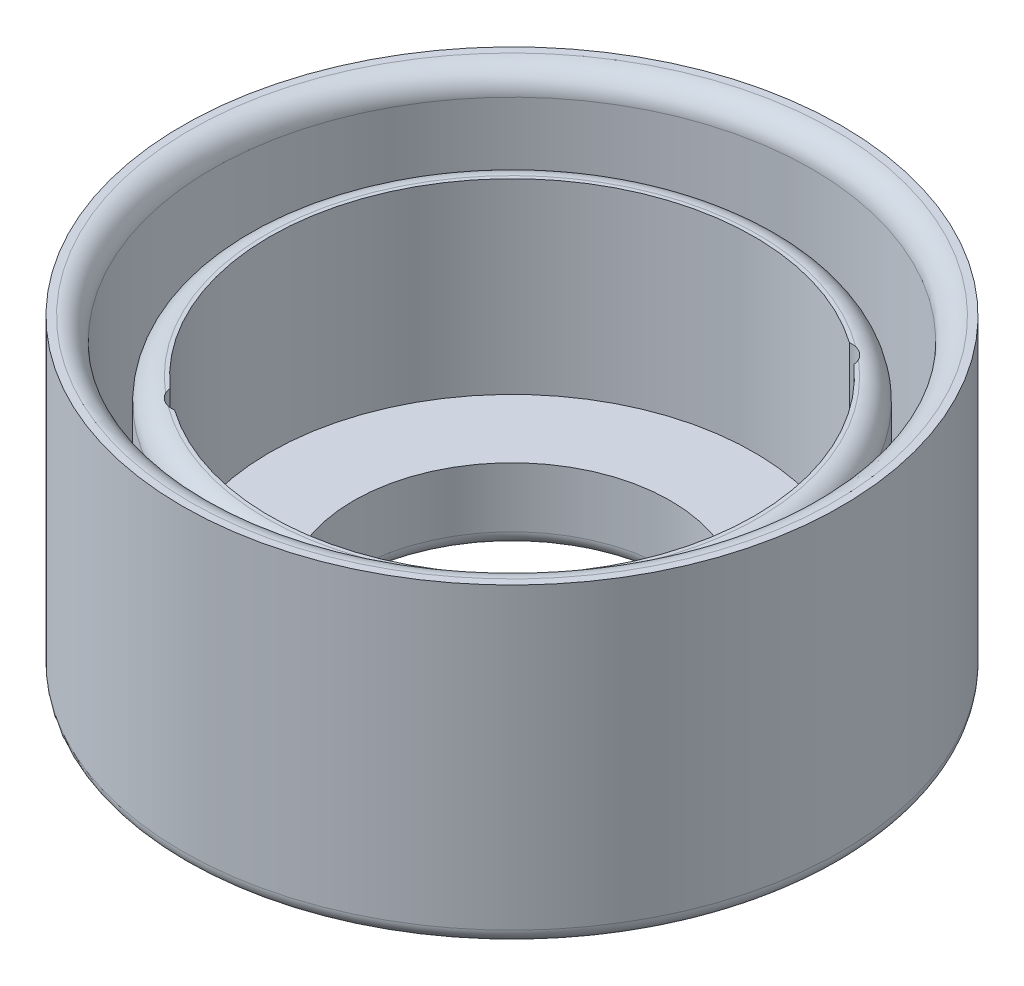
ISO-10303-21;
HEADER;
FILE_DESCRIPTION(('STEP AP214'),'2;1');
FILE_NAME('part.step','',(''),(''),'','','');
FILE_SCHEMA(('AUTOMOTIVE_DESIGN { 1 0 10303 214 1 1 1 1 }'));
ENDSEC;
DATA;
#1=APPLICATION_CONTEXT('core data for automotive mechanical design processes');
#2=APPLICATION_PROTOCOL_DEFINITION('international standard','automotive_design',2000,#1);
#3=PRODUCT_CONTEXT('',#1,'mechanical');
#4=PRODUCT('Part','Part','',(#3));
#5=PRODUCT_RELATED_PRODUCT_CATEGORY('part','',(#4));
#6=PRODUCT_DEFINITION_FORMATION('','',#4);
#7=PRODUCT_DEFINITION_CONTEXT('part definition',#1,'design');
#8=PRODUCT_DEFINITION('design','',#6,#7);
#9=PRODUCT_DEFINITION_SHAPE('','',#8);
#10=(LENGTH_UNIT() NAMED_UNIT(*) SI_UNIT(.MILLI.,.METRE.));
#11=(NAMED_UNIT(*) PLANE_ANGLE_UNIT() SI_UNIT($,.RADIAN.));
#12=(NAMED_UNIT(*) SI_UNIT($,.STERADIAN.) SOLID_ANGLE_UNIT());
#13=UNCERTAINTY_MEASURE_WITH_UNIT(LENGTH_MEASURE(1.E-05),#10,'distance_accuracy_value','');
#14=(GEOMETRIC_REPRESENTATION_CONTEXT(3) GLOBAL_UNCERTAINTY_ASSIGNED_CONTEXT((#13)) GLOBAL_UNIT_ASSIGNED_CONTEXT((#10,
#11,#12)) REPRESENTATION_CONTEXT('',''));
#15=CARTESIAN_POINT('',(0.,0.,0.));
#16=DIRECTION('',(0.,0.,1.));
#17=DIRECTION('',(1.,0.,0.));
#18=AXIS2_PLACEMENT_3D('',#15,#16,#17);
#19=CARTESIAN_POINT('',(0.,12.5,0.));
#20=DIRECTION('',(0.,1.,0.));
#21=DIRECTION('',(0.,0.,1.));
#22=AXIS2_PLACEMENT_3D('',#19,#20,#21);
#23=PLANE('',#22);
#24=CARTESIAN_POINT('',(-9.5,12.5,12.));
#25=DIRECTION('',(0.,1.,0.));
#26=DIRECTION('',(0.,0.,1.));
#27=AXIS2_PLACEMENT_3D('',#24,#25,#26);
#28=CIRCLE('',#27,1.25);
#29=CARTESIAN_POINT('',(-9.33612727853818,12.5,13.2392117378239));
#30=VERTEX_POINT('',#29);
#31=CARTESIAN_POINT('',(-9.79746534669518,12.5,13.2140899338663));
#32=VERTEX_POINT('',#31);
#33=EDGE_CURVE('E205',#30,#32,#28,.F.);
#34=ORIENTED_EDGE('',*,*,#33,.T.);
#35=CARTESIAN_POINT('',(0.,12.5,0.));
#36=DIRECTION('',(0.,1.,0.));
#37=DIRECTION('',(0.,0.,1.));
#38=AXIS2_PLACEMENT_3D('',#35,#36,#37);
#39=CIRCLE('',#38,16.45);
#40=CARTESIAN_POINT('',(10.6134418037851,12.5,-12.5681085720035));
#41=VERTEX_POINT('',#40);
#42=EDGE_CURVE('E132',#32,#41,#39,.T.);
#43=ORIENTED_EDGE('',*,*,#42,.T.);
#44=CARTESIAN_POINT('',(9.5,12.5,-12.));
#45=DIRECTION('',(0.,1.,0.));
#46=DIRECTION('',(0.,0.,1.));
#47=AXIS2_PLACEMENT_3D('',#44,#45,#46);
#48=CIRCLE('',#47,1.25);
#49=CARTESIAN_POINT('',(10.743749989338,12.5,-12.1248437584407));
#50=VERTEX_POINT('',#49);
#51=EDGE_CURVE('E212',#41,#50,#48,.F.);
#52=ORIENTED_EDGE('',*,*,#51,.T.);
#53=CARTESIAN_POINT('',(0.,12.5,0.));
#54=DIRECTION('',(0.,1.,0.));
#55=DIRECTION('',(0.,0.,1.));
#56=AXIS2_PLACEMENT_3D('',#53,#54,#55);
#57=CIRCLE('',#56,16.2);
#58=EDGE_CURVE('E111',#30,#50,#57,.T.);
#59=ORIENTED_EDGE('',*,*,#58,.F.);
#60=EDGE_LOOP('',(#34,#43,#52,#59));
#61=FACE_BOUND('',#60,.T.);
#62=ADVANCED_FACE('F36',(#61),#23,.T.);
#63=CARTESIAN_POINT('',(0.,12.5,0.));
#64=DIRECTION('',(0.,-1.,0.));
#65=DIRECTION('',(0.,0.,-1.));
#66=AXIS2_PLACEMENT_3D('',#63,#64,#65);
#67=CYLINDRICAL_SURFACE('',#66,16.2);
#68=DIRECTION('',(0.,-1.,0.));
#69=VECTOR('',#68,1.);
#70=CARTESIAN_POINT('',(10.743749989338,6.25,-12.1248437584407));
#71=LINE('',#70,#69);
#72=CARTESIAN_POINT('',(10.743749989338,0.,-12.1248437584407));
#73=VERTEX_POINT('',#72);
#74=EDGE_CURVE('E95',#50,#73,#71,.T.);
#75=ORIENTED_EDGE('',*,*,#74,.T.);
#76=CARTESIAN_POINT('',(0.,0.,0.));
#77=DIRECTION('',(0.,1.,0.));
#78=DIRECTION('',(0.,0.,1.));
#79=AXIS2_PLACEMENT_3D('',#76,#77,#78);
#80=CIRCLE('',#79,16.2);
#81=CARTESIAN_POINT('',(-9.33612727853817,0.,13.239211737824));
#82=VERTEX_POINT('',#81);
#83=EDGE_CURVE('E108',#73,#82,#80,.F.);
#84=ORIENTED_EDGE('',*,*,#83,.T.);
#85=DIRECTION('',(0.,-1.,0.));
#86=VECTOR('',#85,1.);
#87=CARTESIAN_POINT('',(-9.33612727853815,6.25,13.239211737824));
#88=LINE('',#87,#86);
#89=EDGE_CURVE('E226',#82,#30,#88,.F.);
#90=ORIENTED_EDGE('',*,*,#89,.T.);
#91=ORIENTED_EDGE('',*,*,#58,.T.);
#92=EDGE_LOOP('',(#75,#84,#90,#91));
#93=FACE_BOUND('',#92,.T.);
#94=ADVANCED_FACE('F106',(#93),#67,.F.);
#95=CARTESIAN_POINT('',(0.,16.,0.));
#96=DIRECTION('',(0.,-1.,0.));
#97=DIRECTION('',(0.,0.,-1.));
#98=AXIS2_PLACEMENT_3D('',#95,#96,#97);
#99=CYLINDRICAL_SURFACE('',#98,20.05);
#100=CARTESIAN_POINT('',(0.,14.5,0.));
#101=DIRECTION('',(0.,1.,0.));
#102=DIRECTION('',(0.,0.,1.));
#103=AXIS2_PLACEMENT_3D('',#100,#101,#102);
#104=CIRCLE('',#103,20.05);
#105=CARTESIAN_POINT('',(0.,14.5,20.05));
#106=VERTEX_POINT('',#105);
#107=EDGE_CURVE('E312',#106,#106,#104,.T.);
#108=ORIENTED_EDGE('',*,*,#107,.T.);
#109=EDGE_LOOP('',(#108));
#110=FACE_BOUND('',#109,.T.);
#111=CARTESIAN_POINT('',(0.,0.,0.));
#112=DIRECTION('',(0.,1.,0.));
#113=DIRECTION('',(0.,0.,1.));
#114=AXIS2_PLACEMENT_3D('',#111,#112,#113);
#115=CIRCLE('',#114,20.05);
#116=CARTESIAN_POINT('',(0.,0.,20.05));
#117=VERTEX_POINT('',#116);
#118=EDGE_CURVE('E122',#117,#117,#115,.T.);
#119=ORIENTED_EDGE('',*,*,#118,.F.);
#120=EDGE_LOOP('',(#119));
#121=FACE_BOUND('',#120,.T.);
#122=ADVANCED_FACE('F187',(#110,#121),#99,.F.);
#123=CARTESIAN_POINT('',(0.,16.,0.));
#124=DIRECTION('',(0.,-1.,0.));
#125=DIRECTION('',(0.,0.,-1.));
#126=AXIS2_PLACEMENT_3D('',#123,#124,#125);
#127=CYLINDRICAL_SURFACE('',#126,22.05);
#128=CARTESIAN_POINT('',(0.,-4.,0.));
#129=DIRECTION('',(0.,1.,0.));
#130=DIRECTION('',(0.,0.,1.));
#131=AXIS2_PLACEMENT_3D('',#128,#129,#130);
#132=CIRCLE('',#131,22.05);
#133=CARTESIAN_POINT('',(0.,-4.,22.05));
#134=VERTEX_POINT('',#133);
#135=EDGE_CURVE('E44',#134,#134,#132,.T.);
#136=ORIENTED_EDGE('',*,*,#135,.T.);
#137=EDGE_LOOP('',(#136));
#138=FACE_BOUND('',#137,.T.);
#139=CARTESIAN_POINT('',(0.,16.,0.));
#140=DIRECTION('',(0.,1.,0.));
#141=DIRECTION('',(0.,0.,1.));
#142=AXIS2_PLACEMENT_3D('',#139,#140,#141);
#143=CIRCLE('',#142,22.05);
#144=CARTESIAN_POINT('',(0.,16.,22.05));
#145=VERTEX_POINT('',#144);
#146=EDGE_CURVE('E118',#145,#145,#143,.T.);
#147=ORIENTED_EDGE('',*,*,#146,.F.);
#148=EDGE_LOOP('',(#147));
#149=FACE_BOUND('',#148,.T.);
#150=ADVANCED_FACE('F183',(#138,#149),#127,.T.);
#151=CARTESIAN_POINT('',(0.,16.,0.));
#152=DIRECTION('',(0.,1.,0.));
#153=DIRECTION('',(0.,0.,1.));
#154=AXIS2_PLACEMENT_3D('',#151,#152,#153);
#155=PLANE('',#154);
#156=CARTESIAN_POINT('',(0.,16.,0.));
#157=DIRECTION('',(0.,1.,0.));
#158=DIRECTION('',(0.,0.,1.));
#159=AXIS2_PLACEMENT_3D('',#156,#157,#158);
#160=CIRCLE('',#159,21.55);
#161=CARTESIAN_POINT('',(0.,16.,21.55));
#162=VERTEX_POINT('',#161);
#163=EDGE_CURVE('E310',#162,#162,#160,.F.);
#164=ORIENTED_EDGE('',*,*,#163,.T.);
#165=EDGE_LOOP('',(#164));
#166=FACE_BOUND('',#165,.T.);
#167=ORIENTED_EDGE('',*,*,#146,.T.);
#168=EDGE_LOOP('',(#167));
#169=FACE_BOUND('',#168,.T.);
#170=ADVANCED_FACE('F176',(#166,#169),#155,.T.);
#171=CARTESIAN_POINT('',(0.,-5.,0.));
#172=DIRECTION('',(0.,1.,0.));
#173=DIRECTION('',(0.,0.,1.));
#174=AXIS2_PLACEMENT_3D('',#171,#172,#173);
#175=PLANE('',#174);
#176=CARTESIAN_POINT('',(0.,-5.,0.));
#177=DIRECTION('',(0.,1.,0.));
#178=DIRECTION('',(0.,0.,1.));
#179=AXIS2_PLACEMENT_3D('',#176,#177,#178);
#180=CIRCLE('',#179,21.05);
#181=CARTESIAN_POINT('',(0.,-5.,21.05));
#182=VERTEX_POINT('',#181);
#183=EDGE_CURVE('E11',#182,#182,#180,.F.);
#184=ORIENTED_EDGE('',*,*,#183,.T.);
#185=EDGE_LOOP('',(#184));
#186=FACE_BOUND('',#185,.T.);
#187=CARTESIAN_POINT('',(0.,-5.,0.));
#188=DIRECTION('',(0.,1.,0.));
#189=DIRECTION('',(0.,0.,1.));
#190=AXIS2_PLACEMENT_3D('',#187,#188,#189);
#191=CIRCLE('',#190,11.6);
#192=CARTESIAN_POINT('',(0.,-5.,11.6));
#193=VERTEX_POINT('',#192);
#194=EDGE_CURVE('E128',#193,#193,#191,.T.);
#195=ORIENTED_EDGE('',*,*,#194,.T.);
#196=EDGE_LOOP('',(#195));
#197=FACE_BOUND('',#196,.T.);
#198=CARTESIAN_POINT('',(9.5,-5.,-12.));
#199=DIRECTION('',(0.,-1.,0.));
#200=DIRECTION('',(0.,0.,-1.));
#201=AXIS2_PLACEMENT_3D('',#198,#199,#200);
#202=CIRCLE('',#201,1.25);
#203=CARTESIAN_POINT('',(9.5,-5.,-13.25));
#204=VERTEX_POINT('',#203);
#205=EDGE_CURVE('E103',#204,#204,#202,.T.);
#206=ORIENTED_EDGE('',*,*,#205,.F.);
#207=EDGE_LOOP('',(#206));
#208=FACE_BOUND('',#207,.T.);
#209=CARTESIAN_POINT('',(-9.5,-5.,12.));
#210=DIRECTION('',(0.,-1.,0.));
#211=DIRECTION('',(0.,0.,-1.));
#212=AXIS2_PLACEMENT_3D('',#209,#210,#211);
#213=CIRCLE('',#212,1.25);
#214=CARTESIAN_POINT('',(-9.5,-5.,10.75));
#215=VERTEX_POINT('',#214);
#216=EDGE_CURVE('E216',#215,#215,#213,.T.);
#217=ORIENTED_EDGE('',*,*,#216,.F.);
#218=EDGE_LOOP('',(#217));
#219=FACE_BOUND('',#218,.T.);
#220=ADVANCED_FACE('F173',(#186,#197,#208,#219),#175,.F.);
#221=CARTESIAN_POINT('',(0.,0.,0.));
#222=DIRECTION('',(0.,1.,0.));
#223=DIRECTION('',(0.,0.,1.));
#224=AXIS2_PLACEMENT_3D('',#221,#222,#223);
#225=PLANE('',#224);
#226=CARTESIAN_POINT('',(0.,0.,0.));
#227=DIRECTION('',(0.,1.,0.));
#228=DIRECTION('',(0.,0.,1.));
#229=AXIS2_PLACEMENT_3D('',#226,#227,#228);
#230=CIRCLE('',#229,17.95);
#231=CARTESIAN_POINT('',(0.,0.,17.95));
#232=VERTEX_POINT('',#231);
#233=EDGE_CURVE('E230',#232,#232,#230,.T.);
#234=ORIENTED_EDGE('',*,*,#233,.F.);
#235=EDGE_LOOP('',(#234));
#236=FACE_BOUND('',#235,.T.);
#237=ORIENTED_EDGE('',*,*,#118,.T.);
#238=EDGE_LOOP('',(#237));
#239=FACE_BOUND('',#238,.T.);
#240=ADVANCED_FACE('F171',(#236,#239),#225,.T.);
#241=DIRECTION('',(0.,-1.,0.));
#242=VECTOR('',#241,1.);
#243=CARTESIAN_POINT('',(9.33612727853815,6.25,-13.239211737824));
#244=LINE('',#243,#242);
#245=CARTESIAN_POINT('',(9.33612727853817,0.,-13.239211737824));
#246=VERTEX_POINT('',#245);
#247=CARTESIAN_POINT('',(9.33612727853818,12.5,-13.2392117378239));
#248=VERTEX_POINT('',#247);
#249=EDGE_CURVE('E98',#246,#248,#244,.F.);
#250=ORIENTED_EDGE('',*,*,#249,.T.);
#251=CARTESIAN_POINT('',(-10.743749989338,12.5,12.1248437584407));
#252=VERTEX_POINT('',#251);
#253=EDGE_CURVE('E215',#248,#252,#57,.T.);
#254=ORIENTED_EDGE('',*,*,#253,.T.);
#255=DIRECTION('',(0.,-1.,0.));
#256=VECTOR('',#255,1.);
#257=CARTESIAN_POINT('',(-10.743749989338,6.25,12.1248437584407));
#258=LINE('',#257,#256);
#259=CARTESIAN_POINT('',(-10.743749989338,0.,12.1248437584407));
#260=VERTEX_POINT('',#259);
#261=EDGE_CURVE('E223',#252,#260,#258,.T.);
#262=ORIENTED_EDGE('',*,*,#261,.T.);
#263=EDGE_CURVE('E117',#260,#246,#80,.F.);
#264=ORIENTED_EDGE('',*,*,#263,.T.);
#265=EDGE_LOOP('',(#250,#254,#262,#264));
#266=FACE_BOUND('',#265,.T.);
#267=ADVANCED_FACE('F167',(#266),#67,.F.);
#268=CARTESIAN_POINT('',(0.,12.5,0.));
#269=DIRECTION('',(0.,-1.,0.));
#270=DIRECTION('',(0.,0.,-1.));
#271=AXIS2_PLACEMENT_3D('',#268,#269,#270);
#272=CYLINDRICAL_SURFACE('',#271,17.95);
#273=CARTESIAN_POINT('',(0.,11.,0.));
#274=DIRECTION('',(0.,1.,0.));
#275=DIRECTION('',(0.,0.,1.));
#276=AXIS2_PLACEMENT_3D('',#273,#274,#275);
#277=CIRCLE('',#276,17.95);
#278=CARTESIAN_POINT('',(0.,11.,17.95));
#279=VERTEX_POINT('',#278);
#280=EDGE_CURVE('E316',#279,#279,#277,.F.);
#281=ORIENTED_EDGE('',*,*,#280,.T.);
#282=EDGE_LOOP('',(#281));
#283=FACE_BOUND('',#282,.T.);
#284=ORIENTED_EDGE('',*,*,#233,.T.);
#285=EDGE_LOOP('',(#284));
#286=FACE_BOUND('',#285,.T.);
#287=ADVANCED_FACE('F164',(#283,#286),#272,.T.);
#288=CARTESIAN_POINT('',(9.79746534669518,12.5,-13.2140899338663));
#289=VERTEX_POINT('',#288);
#290=EDGE_CURVE('E211',#248,#289,#48,.F.);
#291=ORIENTED_EDGE('',*,*,#290,.T.);
#292=CARTESIAN_POINT('',(0.,12.5,0.));
#293=DIRECTION('',(0.,1.,0.));
#294=DIRECTION('',(0.,0.,1.));
#295=AXIS2_PLACEMENT_3D('',#292,#293,#294);
#296=CIRCLE('',#295,16.45);
#297=CARTESIAN_POINT('',(-10.6134418037851,12.5,12.5681085720035));
#298=VERTEX_POINT('',#297);
#299=EDGE_CURVE('E51',#289,#298,#296,.T.);
#300=ORIENTED_EDGE('',*,*,#299,.T.);
#301=EDGE_CURVE('E208',#298,#252,#28,.F.);
#302=ORIENTED_EDGE('',*,*,#301,.T.);
#303=ORIENTED_EDGE('',*,*,#253,.F.);
#304=EDGE_LOOP('',(#291,#300,#302,#303));
#305=FACE_BOUND('',#304,.T.);
#306=ADVANCED_FACE('F161',(#305),#23,.T.);
#307=CARTESIAN_POINT('',(9.5,0.,-12.));
#308=DIRECTION('',(0.,1.,0.));
#309=DIRECTION('',(0.,0.,1.));
#310=AXIS2_PLACEMENT_3D('',#307,#308,#309);
#311=CIRCLE('',#310,1.25);
#312=EDGE_CURVE('E90',#73,#246,#311,.F.);
#313=ORIENTED_EDGE('',*,*,#312,.T.);
#314=ORIENTED_EDGE('',*,*,#263,.F.);
#315=CARTESIAN_POINT('',(-9.5,0.,12.));
#316=DIRECTION('',(0.,1.,0.));
#317=DIRECTION('',(0.,0.,1.));
#318=AXIS2_PLACEMENT_3D('',#315,#316,#317);
#319=CIRCLE('',#318,1.25);
#320=EDGE_CURVE('E116',#260,#82,#319,.F.);
#321=ORIENTED_EDGE('',*,*,#320,.T.);
#322=ORIENTED_EDGE('',*,*,#83,.F.);
#323=EDGE_LOOP('',(#313,#314,#321,#322));
#324=FACE_BOUND('',#323,.T.);
#325=CARTESIAN_POINT('',(0.,0.,0.));
#326=DIRECTION('',(0.,1.,0.));
#327=DIRECTION('',(0.,0.,1.));
#328=AXIS2_PLACEMENT_3D('',#325,#326,#327);
#329=CIRCLE('',#328,10.6);
#330=CARTESIAN_POINT('',(0.,0.,10.6));
#331=VERTEX_POINT('',#330);
#332=EDGE_CURVE('E207',#331,#331,#329,.F.);
#333=ORIENTED_EDGE('',*,*,#332,.T.);
#334=EDGE_LOOP('',(#333));
#335=FACE_BOUND('',#334,.T.);
#336=ADVANCED_FACE('F114',(#324,#335),#225,.T.);
#337=CARTESIAN_POINT('',(0.,16.001,0.));
#338=DIRECTION('',(0.,-1.,0.));
#339=DIRECTION('',(0.,0.,-1.));
#340=AXIS2_PLACEMENT_3D('',#337,#338,#339);
#341=CYLINDRICAL_SURFACE('',#340,10.6);
#342=CARTESIAN_POINT('',(0.,-4.,0.));
#343=DIRECTION('',(0.,1.,0.));
#344=DIRECTION('',(0.,0.,1.));
#345=AXIS2_PLACEMENT_3D('',#342,#343,#344);
#346=CIRCLE('',#345,10.6);
#347=CARTESIAN_POINT('',(0.,-4.,10.6));
#348=VERTEX_POINT('',#347);
#349=EDGE_CURVE('E120',#348,#348,#346,.F.);
#350=ORIENTED_EDGE('',*,*,#349,.T.);
#351=EDGE_LOOP('',(#350));
#352=FACE_BOUND('',#351,.T.);
#353=ORIENTED_EDGE('',*,*,#332,.F.);
#354=EDGE_LOOP('',(#353));
#355=FACE_BOUND('',#354,.T.);
#356=ADVANCED_FACE('F157',(#352,#355),#341,.F.);
#357=CARTESIAN_POINT('',(-9.5,16.001,12.));
#358=DIRECTION('',(0.,-1.,0.));
#359=DIRECTION('',(0.,0.,-1.));
#360=AXIS2_PLACEMENT_3D('',#357,#358,#359);
#361=CYLINDRICAL_SURFACE('',#360,1.25);
#362=ORIENTED_EDGE('',*,*,#301,.F.);
#363=CARTESIAN_POINT('',(-10.6134418037851,12.5,12.5681085720035));
#364=CARTESIAN_POINT('',(-10.5974693051042,12.4999955857231,12.5994122292792));
#365=CARTESIAN_POINT('',(-10.5801849303666,12.4998154547105,12.6300259541382));
#366=CARTESIAN_POINT('',(-10.5431032711217,12.4992730166514,12.6896888685928));
#367=CARTESIAN_POINT('',(-10.5233060578339,12.4989107147671,12.7187381024965));
#368=CARTESIAN_POINT('',(-10.4603572241707,12.4978052324506,12.803201243663));
#369=CARTESIAN_POINT('',(-10.413611941876,12.4970427032076,12.8560018997303));
#370=CARTESIAN_POINT('',(-10.311912333877,12.496239685228,12.9530215912153));
#371=CARTESIAN_POINT('',(-10.2569516674792,12.4961997571318,12.9972339369646));
#372=CARTESIAN_POINT('',(-10.1404261660347,12.4968771766773,13.0757675632655));
#373=CARTESIAN_POINT('',(-10.0788696594301,12.4975935792068,13.1101011202215));
#374=CARTESIAN_POINT('',(-9.97991155769251,12.498740221059,13.1548450538157));
#375=CARTESIAN_POINT('',(-9.94417774732183,12.4991533324704,13.1690520624144));
#376=CARTESIAN_POINT('',(-9.87159713212776,12.4997795763179,13.1941050103179));
#377=CARTESIAN_POINT('',(-9.83475171237041,12.4999929478046,13.2049549569411));
#378=CARTESIAN_POINT('',(-9.79746534669518,12.5,13.2140899338663));
#379=B_SPLINE_CURVE_WITH_KNOTS('',3,(#363,#364,#365,#366,#367,#368,#369,#370,#371,#372,#373,
#374,#375,#376,#377,#378),.UNSPECIFIED.,.F.,.F.,(4,2,2,2,2,2,2,4),(0.,0.10536206176478,
0.210721138001865,0.421202047950025,0.631846255506514,0.842227552906534,0.957452648632271,
1.07253966495442),.UNSPECIFIED.);
#380=EDGE_CURVE('E58',#298,#32,#379,.T.);
#381=ORIENTED_EDGE('',*,*,#380,.T.);
#382=ORIENTED_EDGE('',*,*,#33,.F.);
#383=ORIENTED_EDGE('',*,*,#89,.F.);
#384=ORIENTED_EDGE('',*,*,#320,.F.);
#385=ORIENTED_EDGE('',*,*,#261,.F.);
#386=EDGE_LOOP('',(#362,#381,#382,#383,#384,#385));
#387=FACE_BOUND('',#386,.T.);
#388=ORIENTED_EDGE('',*,*,#216,.T.);
#389=EDGE_LOOP('',(#388));
#390=FACE_BOUND('',#389,.T.);
#391=ADVANCED_FACE('F153',(#387,#390),#361,.F.);
#392=CARTESIAN_POINT('',(9.5,16.001,-12.));
#393=DIRECTION('',(0.,-1.,0.));
#394=DIRECTION('',(0.,0.,-1.));
#395=AXIS2_PLACEMENT_3D('',#392,#393,#394);
#396=CYLINDRICAL_SURFACE('',#395,1.25);
#397=ORIENTED_EDGE('',*,*,#51,.F.);
#398=CARTESIAN_POINT('',(10.6134418037851,12.5,-12.5681085720035));
#399=CARTESIAN_POINT('',(10.5974693051042,12.4999955857231,-12.5994122292792));
#400=CARTESIAN_POINT('',(10.5801849303666,12.4998154547105,-12.6300259541382));
#401=CARTESIAN_POINT('',(10.5431032711217,12.4992730166514,-12.6896888685928));
#402=CARTESIAN_POINT('',(10.5233060578339,12.4989107147671,-12.7187381024965));
#403=CARTESIAN_POINT('',(10.4603572241707,12.4978052324506,-12.803201243663));
#404=CARTESIAN_POINT('',(10.413611941876,12.4970427032076,-12.8560018997303));
#405=CARTESIAN_POINT('',(10.311912333877,12.496239685228,-12.9530215912153));
#406=CARTESIAN_POINT('',(10.2569516674792,12.4961997571318,-12.9972339369646));
#407=CARTESIAN_POINT('',(10.1404261660347,12.4968771766773,-13.0757675632655));
#408=CARTESIAN_POINT('',(10.0788696594301,12.4975935792068,-13.1101011202215));
#409=CARTESIAN_POINT('',(9.97991155769251,12.498740221059,-13.1548450538157));
#410=CARTESIAN_POINT('',(9.94417774732183,12.4991533324704,-13.1690520624144));
#411=CARTESIAN_POINT('',(9.87159713212776,12.4997795763179,-13.1941050103179));
#412=CARTESIAN_POINT('',(9.83475171237041,12.4999929478046,-13.2049549569411));
#413=CARTESIAN_POINT('',(9.79746534669518,12.5,-13.2140899338663));
#414=B_SPLINE_CURVE_WITH_KNOTS('',3,(#398,#399,#400,#401,#402,#403,#404,#405,#406,#407,#408,
#409,#410,#411,#412,#413),.UNSPECIFIED.,.F.,.F.,(4,2,2,2,2,2,2,4),(0.,0.10536206176478,
0.210721138001865,0.421202047950025,0.631846255506514,0.842227552906534,0.957452648632271,
1.07253966495442),.UNSPECIFIED.);
#415=EDGE_CURVE('E135',#41,#289,#414,.T.);
#416=ORIENTED_EDGE('',*,*,#415,.T.);
#417=ORIENTED_EDGE('',*,*,#290,.F.);
#418=ORIENTED_EDGE('',*,*,#249,.F.);
#419=ORIENTED_EDGE('',*,*,#312,.F.);
#420=ORIENTED_EDGE('',*,*,#74,.F.);
#421=EDGE_LOOP('',(#397,#416,#417,#418,#419,#420));
#422=FACE_BOUND('',#421,.T.);
#423=ORIENTED_EDGE('',*,*,#205,.T.);
#424=EDGE_LOOP('',(#423));
#425=FACE_BOUND('',#424,.T.);
#426=ADVANCED_FACE('F93',(#422,#425),#396,.F.);
#427=CARTESIAN_POINT('',(0.,-4.,0.));
#428=DIRECTION('',(0.,1.,0.));
#429=DIRECTION('',(0.,0.,1.));
#430=AXIS2_PLACEMENT_3D('',#427,#428,#429);
#431=TOROIDAL_SURFACE('',#430,11.6,1.);
#432=ORIENTED_EDGE('',*,*,#194,.F.);
#433=EDGE_LOOP('',(#432));
#434=FACE_BOUND('',#433,.T.);
#435=ORIENTED_EDGE('',*,*,#349,.F.);
#436=EDGE_LOOP('',(#435));
#437=FACE_BOUND('',#436,.T.);
#438=ADVANCED_FACE('F152',(#434,#437),#431,.T.);
#439=CARTESIAN_POINT('',(0.,11.,0.));
#440=DIRECTION('',(0.,1.,0.));
#441=DIRECTION('',(0.,0.,1.));
#442=AXIS2_PLACEMENT_3D('',#439,#440,#441);
#443=TOROIDAL_SURFACE('',#442,16.45,1.5);
#444=ORIENTED_EDGE('',*,*,#280,.F.);
#445=EDGE_LOOP('',(#444));
#446=FACE_BOUND('',#445,.T.);
#447=ORIENTED_EDGE('',*,*,#415,.F.);
#448=ORIENTED_EDGE('',*,*,#42,.F.);
#449=ORIENTED_EDGE('',*,*,#380,.F.);
#450=ORIENTED_EDGE('',*,*,#299,.F.);
#451=EDGE_LOOP('',(#447,#448,#449,#450));
#452=FACE_BOUND('',#451,.T.);
#453=ADVANCED_FACE('F147',(#446,#452),#443,.T.);
#454=CARTESIAN_POINT('',(0.,14.5,0.));
#455=DIRECTION('',(0.,1.,0.));
#456=DIRECTION('',(0.,0.,1.));
#457=AXIS2_PLACEMENT_3D('',#454,#455,#456);
#458=TOROIDAL_SURFACE('',#457,21.55,1.5);
#459=ORIENTED_EDGE('',*,*,#163,.F.);
#460=EDGE_LOOP('',(#459));
#461=FACE_BOUND('',#460,.T.);
#462=ORIENTED_EDGE('',*,*,#107,.F.);
#463=EDGE_LOOP('',(#462));
#464=FACE_BOUND('',#463,.T.);
#465=ADVANCED_FACE('F196',(#461,#464),#458,.T.);
#466=CARTESIAN_POINT('',(0.,-4.,0.));
#467=DIRECTION('',(0.,1.,0.));
#468=DIRECTION('',(0.,0.,1.));
#469=AXIS2_PLACEMENT_3D('',#466,#467,#468);
#470=TOROIDAL_SURFACE('',#469,21.05,1.);
#471=ORIENTED_EDGE('',*,*,#183,.F.);
#472=EDGE_LOOP('',(#471));
#473=FACE_BOUND('',#472,.T.);
#474=ORIENTED_EDGE('',*,*,#135,.F.);
#475=EDGE_LOOP('',(#474));
#476=FACE_BOUND('',#475,.T.);
#477=ADVANCED_FACE('F38',(#473,#476),#470,.T.);
#478=CLOSED_SHELL('',(#62,#94,#122,#150,#170,#220,#240,#267,#287,#306,#336,#356,#391,#426,#438,
#453,#465,#477));
#479=MANIFOLD_SOLID_BREP('B2',#478);
#480=ADVANCED_BREP_SHAPE_REPRESENTATION('',(#18,#479),#14);
#481=SHAPE_DEFINITION_REPRESENTATION(#9,#480);
ENDSEC;
END-ISO-10303-21;
